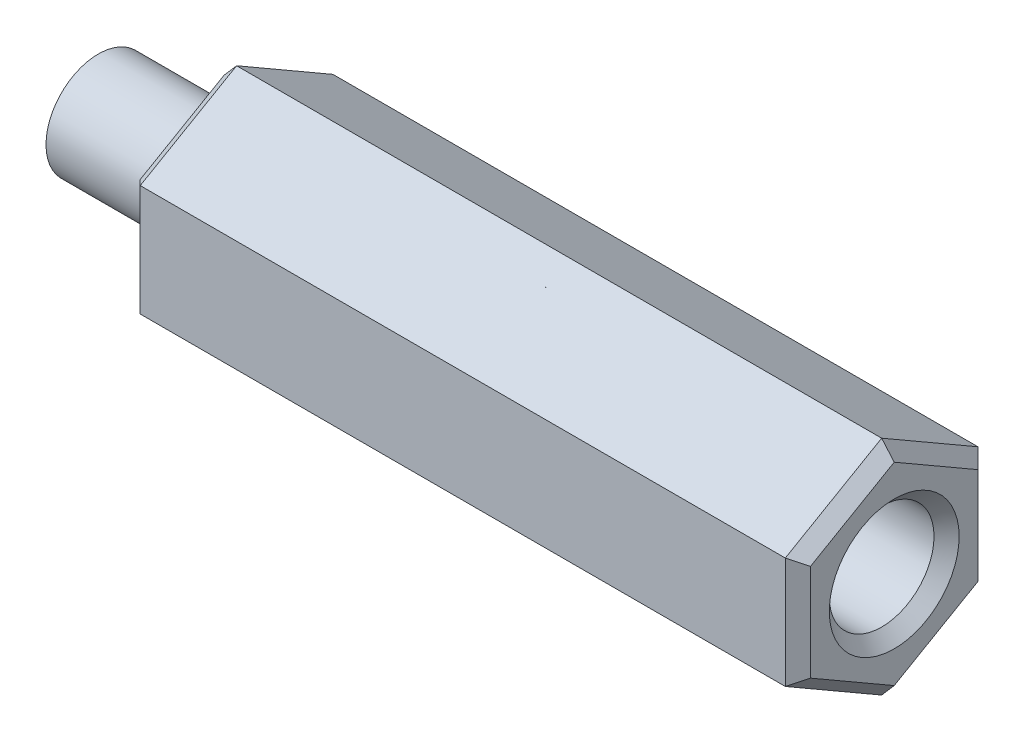
ISO-10303-21;
HEADER;
FILE_DESCRIPTION(('STEP AP214'),'2;1');
FILE_NAME('part.step','',(''),(''),'','','');
FILE_SCHEMA(('AUTOMOTIVE_DESIGN { 1 0 10303 214 1 1 1 1 }'));
ENDSEC;
DATA;
#1=APPLICATION_CONTEXT('core data for automotive mechanical design processes');
#2=APPLICATION_PROTOCOL_DEFINITION('international standard','automotive_design',2000,#1);
#3=PRODUCT_CONTEXT('',#1,'mechanical');
#4=PRODUCT('Part','Part','',(#3));
#5=PRODUCT_RELATED_PRODUCT_CATEGORY('part','',(#4));
#6=PRODUCT_DEFINITION_FORMATION('','',#4);
#7=PRODUCT_DEFINITION_CONTEXT('part definition',#1,'design');
#8=PRODUCT_DEFINITION('design','',#6,#7);
#9=PRODUCT_DEFINITION_SHAPE('','',#8);
#10=(LENGTH_UNIT() NAMED_UNIT(*) SI_UNIT(.MILLI.,.METRE.));
#11=(NAMED_UNIT(*) PLANE_ANGLE_UNIT() SI_UNIT($,.RADIAN.));
#12=(NAMED_UNIT(*) SI_UNIT($,.STERADIAN.) SOLID_ANGLE_UNIT());
#13=UNCERTAINTY_MEASURE_WITH_UNIT(LENGTH_MEASURE(1.E-05),#10,'distance_accuracy_value','');
#14=(GEOMETRIC_REPRESENTATION_CONTEXT(3) GLOBAL_UNCERTAINTY_ASSIGNED_CONTEXT((#13)) GLOBAL_UNIT_ASSIGNED_CONTEXT((#10,
#11,#12)) REPRESENTATION_CONTEXT('',''));
#15=CARTESIAN_POINT('',(0.,0.,0.));
#16=DIRECTION('',(0.,0.,1.));
#17=DIRECTION('',(1.,0.,0.));
#18=AXIS2_PLACEMENT_3D('',#15,#16,#17);
#19=CARTESIAN_POINT('',(16.,0.,0.));
#20=DIRECTION('',(-1.,0.,0.));
#21=DIRECTION('',(0.,0.,1.));
#22=AXIS2_PLACEMENT_3D('',#19,#20,#21);
#23=CYLINDRICAL_SURFACE('',#22,1.25);
#24=CARTESIAN_POINT('',(15.7,0.,0.));
#25=DIRECTION('',(1.,0.,0.));
#26=DIRECTION('',(0.,0.,-1.));
#27=AXIS2_PLACEMENT_3D('',#24,#25,#26);
#28=CIRCLE('',#27,1.25);
#29=CARTESIAN_POINT('',(15.7,0.,-1.25));
#30=VERTEX_POINT('',#29);
#31=EDGE_CURVE('E164',#30,#30,#28,.T.);
#32=ORIENTED_EDGE('',*,*,#31,.T.);
#33=EDGE_LOOP('',(#32));
#34=FACE_BOUND('',#33,.T.);
#35=CARTESIAN_POINT('',(2.,0.,0.));
#36=DIRECTION('',(-1.,0.,0.));
#37=DIRECTION('',(0.,0.,1.));
#38=AXIS2_PLACEMENT_3D('',#35,#36,#37);
#39=CIRCLE('',#38,1.25);
#40=CARTESIAN_POINT('',(2.,0.,1.25));
#41=VERTEX_POINT('',#40);
#42=EDGE_CURVE('E50',#41,#41,#39,.T.);
#43=ORIENTED_EDGE('',*,*,#42,.T.);
#44=EDGE_LOOP('',(#43));
#45=FACE_BOUND('',#44,.T.);
#46=ADVANCED_FACE('F45',(#34,#45),#23,.F.);
#47=CARTESIAN_POINT('',(16.,0.,0.));
#48=DIRECTION('',(1.,0.,0.));
#49=DIRECTION('',(0.,0.,-1.));
#50=AXIS2_PLACEMENT_3D('',#47,#48,#49);
#51=PLANE('',#50);
#52=CARTESIAN_POINT('',(16.,0.,0.));
#53=DIRECTION('',(1.,0.,0.));
#54=DIRECTION('',(0.,0.,-1.));
#55=AXIS2_PLACEMENT_3D('',#52,#53,#54);
#56=CIRCLE('',#55,1.55);
#57=CARTESIAN_POINT('',(16.,0.,-1.55));
#58=VERTEX_POINT('',#57);
#59=EDGE_CURVE('E55',#58,#58,#56,.F.);
#60=ORIENTED_EDGE('',*,*,#59,.T.);
#61=EDGE_LOOP('',(#60));
#62=FACE_BOUND('',#61,.T.);
#63=DIRECTION('',(0.,0.5,-0.866025403784439));
#64=VECTOR('',#63,1.);
#65=CARTESIAN_POINT('',(16.,-1.06809799800081,-2.15));
#66=LINE('',#65,#64);
#67=CARTESIAN_POINT('',(16.,-2.3094010767585,0.));
#68=VERTEX_POINT('',#67);
#69=CARTESIAN_POINT('',(16.,-1.15470053837925,-2.));
#70=VERTEX_POINT('',#69);
#71=EDGE_CURVE('E63',#68,#70,#66,.T.);
#72=ORIENTED_EDGE('',*,*,#71,.T.);
#73=DIRECTION('',(0.,1.,0.));
#74=VECTOR('',#73,1.);
#75=CARTESIAN_POINT('',(16.,1.32790561913614,-2.));
#76=LINE('',#75,#74);
#77=CARTESIAN_POINT('',(16.,1.15470053837925,-2.));
#78=VERTEX_POINT('',#77);
#79=EDGE_CURVE('E204',#70,#78,#76,.T.);
#80=ORIENTED_EDGE('',*,*,#79,.T.);
#81=DIRECTION('',(0.,0.5,0.866025403784439));
#82=VECTOR('',#81,1.);
#83=CARTESIAN_POINT('',(16.,2.39600361713695,0.15));
#84=LINE('',#83,#82);
#85=CARTESIAN_POINT('',(16.,2.3094010767585,0.));
#86=VERTEX_POINT('',#85);
#87=EDGE_CURVE('E196',#78,#86,#84,.T.);
#88=ORIENTED_EDGE('',*,*,#87,.T.);
#89=DIRECTION('',(0.,-0.5,0.866025403784439));
#90=VECTOR('',#89,1.);
#91=CARTESIAN_POINT('',(16.,1.06809799800081,2.15));
#92=LINE('',#91,#90);
#93=CARTESIAN_POINT('',(16.,1.15470053837925,2.));
#94=VERTEX_POINT('',#93);
#95=EDGE_CURVE('E198',#86,#94,#92,.T.);
#96=ORIENTED_EDGE('',*,*,#95,.T.);
#97=DIRECTION('',(0.,-1.,0.));
#98=VECTOR('',#97,1.);
#99=CARTESIAN_POINT('',(16.,-1.32790561913614,2.));
#100=LINE('',#99,#98);
#101=CARTESIAN_POINT('',(16.,-1.15470053837925,2.));
#102=VERTEX_POINT('',#101);
#103=EDGE_CURVE('E200',#94,#102,#100,.T.);
#104=ORIENTED_EDGE('',*,*,#103,.T.);
#105=DIRECTION('',(0.,-0.5,-0.866025403784439));
#106=VECTOR('',#105,1.);
#107=CARTESIAN_POINT('',(16.,-2.39600361713695,-0.149999999999998));
#108=LINE('',#107,#106);
#109=EDGE_CURVE('E68',#102,#68,#108,.T.);
#110=ORIENTED_EDGE('',*,*,#109,.T.);
#111=EDGE_LOOP('',(#72,#80,#88,#96,#104,#110));
#112=FACE_BOUND('',#111,.T.);
#113=ADVANCED_FACE('F310',(#62,#112),#51,.T.);
#114=CARTESIAN_POINT('',(0.,0.,0.));
#115=DIRECTION('',(1.,0.,0.));
#116=DIRECTION('',(0.,0.,-1.));
#117=AXIS2_PLACEMENT_3D('',#114,#115,#116);
#118=PLANE('',#117);
#119=CARTESIAN_POINT('',(0.,0.,0.));
#120=DIRECTION('',(-1.,0.,0.));
#121=DIRECTION('',(0.,0.,1.));
#122=AXIS2_PLACEMENT_3D('',#119,#120,#121);
#123=CIRCLE('',#122,1.25);
#124=CARTESIAN_POINT('',(0.,0.,1.25));
#125=VERTEX_POINT('',#124);
#126=EDGE_CURVE('E11',#125,#125,#123,.T.);
#127=ORIENTED_EDGE('',*,*,#126,.F.);
#128=EDGE_LOOP('',(#127));
#129=FACE_BOUND('',#128,.T.);
#130=DIRECTION('',(0.,1.,0.));
#131=VECTOR('',#130,1.);
#132=CARTESIAN_POINT('',(0.,0.,2.));
#133=LINE('',#132,#131);
#134=CARTESIAN_POINT('',(0.,-1.15470053837925,2.));
#135=VERTEX_POINT('',#134);
#136=CARTESIAN_POINT('',(0.,1.15470053837925,2.));
#137=VERTEX_POINT('',#136);
#138=EDGE_CURVE('E163',#135,#137,#133,.T.);
#139=ORIENTED_EDGE('',*,*,#138,.T.);
#140=DIRECTION('',(0.,0.5,-0.866025403784439));
#141=VECTOR('',#140,1.);
#142=CARTESIAN_POINT('',(0.,1.73205080756888,1.));
#143=LINE('',#142,#141);
#144=CARTESIAN_POINT('',(0.,2.3094010767585,0.));
#145=VERTEX_POINT('',#144);
#146=EDGE_CURVE('E142',#137,#145,#143,.T.);
#147=ORIENTED_EDGE('',*,*,#146,.T.);
#148=DIRECTION('',(0.,-0.5,-0.866025403784439));
#149=VECTOR('',#148,1.);
#150=CARTESIAN_POINT('',(0.,1.73205080756888,-1.));
#151=LINE('',#150,#149);
#152=CARTESIAN_POINT('',(0.,1.15470053837925,-2.));
#153=VERTEX_POINT('',#152);
#154=EDGE_CURVE('E152',#145,#153,#151,.T.);
#155=ORIENTED_EDGE('',*,*,#154,.T.);
#156=DIRECTION('',(0.,-1.,0.));
#157=VECTOR('',#156,1.);
#158=CARTESIAN_POINT('',(0.,0.,-2.));
#159=LINE('',#158,#157);
#160=CARTESIAN_POINT('',(0.,-1.15470053837925,-2.));
#161=VERTEX_POINT('',#160);
#162=EDGE_CURVE('E158',#153,#161,#159,.T.);
#163=ORIENTED_EDGE('',*,*,#162,.T.);
#164=DIRECTION('',(0.,-0.5,0.866025403784439));
#165=VECTOR('',#164,1.);
#166=CARTESIAN_POINT('',(0.,-1.73205080756888,-1.));
#167=LINE('',#166,#165);
#168=CARTESIAN_POINT('',(0.,-2.3094010767585,0.));
#169=VERTEX_POINT('',#168);
#170=EDGE_CURVE('E261',#161,#169,#167,.T.);
#171=ORIENTED_EDGE('',*,*,#170,.T.);
#172=DIRECTION('',(0.,0.5,0.866025403784439));
#173=VECTOR('',#172,1.);
#174=CARTESIAN_POINT('',(0.,-1.73205080756888,1.));
#175=LINE('',#174,#173);
#176=EDGE_CURVE('E169',#169,#135,#175,.T.);
#177=ORIENTED_EDGE('',*,*,#176,.T.);
#178=EDGE_LOOP('',(#139,#147,#155,#163,#171,#177));
#179=FACE_BOUND('',#178,.T.);
#180=ADVANCED_FACE('F161',(#129,#179),#118,.F.);
#181=CARTESIAN_POINT('',(16.,1.32790561913614,-2.3));
#182=DIRECTION('',(0.,-0.866025403784439,0.5));
#183=DIRECTION('',(0.,-0.5,-0.866025403784439));
#184=AXIS2_PLACEMENT_3D('',#181,#182,#183);
#185=PLANE('',#184);
#186=DIRECTION('',(-1.,0.,0.));
#187=VECTOR('',#186,1.);
#188=CARTESIAN_POINT('',(16.,1.32790561913614,-2.3));
#189=LINE('',#188,#187);
#190=CARTESIAN_POINT('',(15.7,1.32790561913614,-2.3));
#191=VERTEX_POINT('',#190);
#192=CARTESIAN_POINT('',(0.300000000000002,1.32790561913614,-2.3));
#193=VERTEX_POINT('',#192);
#194=EDGE_CURVE('E219',#191,#193,#189,.T.);
#195=ORIENTED_EDGE('',*,*,#194,.T.);
#196=DIRECTION('',(0.,0.5,0.866025403784439));
#197=VECTOR('',#196,1.);
#198=CARTESIAN_POINT('',(0.300000000000002,1.32790561913614,-2.3));
#199=LINE('',#198,#197);
#200=CARTESIAN_POINT('',(0.300000000000002,2.65581123827228,0.));
#201=VERTEX_POINT('',#200);
#202=EDGE_CURVE('E194',#193,#201,#199,.T.);
#203=ORIENTED_EDGE('',*,*,#202,.T.);
#204=DIRECTION('',(-1.,0.,0.));
#205=VECTOR('',#204,1.);
#206=CARTESIAN_POINT('',(16.,2.65581123827228,0.));
#207=LINE('',#206,#205);
#208=CARTESIAN_POINT('',(15.7,2.65581123827228,0.));
#209=VERTEX_POINT('',#208);
#210=EDGE_CURVE('E159',#209,#201,#207,.T.);
#211=ORIENTED_EDGE('',*,*,#210,.F.);
#212=DIRECTION('',(0.,-0.5,-0.866025403784439));
#213=VECTOR('',#212,1.);
#214=CARTESIAN_POINT('',(15.7,1.32790561913614,-2.3));
#215=LINE('',#214,#213);
#216=EDGE_CURVE('E192',#209,#191,#215,.T.);
#217=ORIENTED_EDGE('',*,*,#216,.T.);
#218=EDGE_LOOP('',(#195,#203,#211,#217));
#219=FACE_BOUND('',#218,.T.);
#220=ADVANCED_FACE('F319',(#219),#185,.F.);
#221=CARTESIAN_POINT('',(16.,2.65581123827228,0.));
#222=DIRECTION('',(0.,-0.866025403784438,-0.5));
#223=DIRECTION('',(0.,0.5,-0.866025403784438));
#224=AXIS2_PLACEMENT_3D('',#221,#222,#223);
#225=PLANE('',#224);
#226=ORIENTED_EDGE('',*,*,#210,.T.);
#227=DIRECTION('',(0.,-0.5,0.866025403784438));
#228=VECTOR('',#227,1.);
#229=CARTESIAN_POINT('',(0.300000000000002,2.65581123827228,0.));
#230=LINE('',#229,#228);
#231=CARTESIAN_POINT('',(0.300000000000002,1.32790561913614,2.3));
#232=VERTEX_POINT('',#231);
#233=EDGE_CURVE('E145',#201,#232,#230,.T.);
#234=ORIENTED_EDGE('',*,*,#233,.T.);
#235=DIRECTION('',(-1.,0.,0.));
#236=VECTOR('',#235,1.);
#237=CARTESIAN_POINT('',(16.,1.32790561913614,2.3));
#238=LINE('',#237,#236);
#239=CARTESIAN_POINT('',(15.7,1.32790561913614,2.3));
#240=VERTEX_POINT('',#239);
#241=EDGE_CURVE('E247',#240,#232,#238,.T.);
#242=ORIENTED_EDGE('',*,*,#241,.F.);
#243=DIRECTION('',(0.,0.5,-0.866025403784438));
#244=VECTOR('',#243,1.);
#245=CARTESIAN_POINT('',(15.7,2.65581123827228,0.));
#246=LINE('',#245,#244);
#247=EDGE_CURVE('E167',#240,#209,#246,.T.);
#248=ORIENTED_EDGE('',*,*,#247,.T.);
#249=EDGE_LOOP('',(#226,#234,#242,#248));
#250=FACE_BOUND('',#249,.T.);
#251=ADVANCED_FACE('F252',(#250),#225,.F.);
#252=CARTESIAN_POINT('',(16.,1.32790561913614,2.3));
#253=DIRECTION('',(0.,0.,-1.));
#254=DIRECTION('',(0.,1.,0.));
#255=AXIS2_PLACEMENT_3D('',#252,#253,#254);
#256=PLANE('',#255);
#257=ORIENTED_EDGE('',*,*,#241,.T.);
#258=DIRECTION('',(0.,-1.,0.));
#259=VECTOR('',#258,1.);
#260=CARTESIAN_POINT('',(0.300000000000002,1.32790561913614,2.3));
#261=LINE('',#260,#259);
#262=CARTESIAN_POINT('',(0.300000000000002,-1.32790561913614,2.3));
#263=VERTEX_POINT('',#262);
#264=EDGE_CURVE('E177',#232,#263,#261,.T.);
#265=ORIENTED_EDGE('',*,*,#264,.T.);
#266=DIRECTION('',(-1.,0.,0.));
#267=VECTOR('',#266,1.);
#268=CARTESIAN_POINT('',(16.,-1.32790561913614,2.3));
#269=LINE('',#268,#267);
#270=CARTESIAN_POINT('',(15.7,-1.32790561913614,2.3));
#271=VERTEX_POINT('',#270);
#272=EDGE_CURVE('E249',#271,#263,#269,.T.);
#273=ORIENTED_EDGE('',*,*,#272,.F.);
#274=DIRECTION('',(0.,1.,0.));
#275=VECTOR('',#274,1.);
#276=CARTESIAN_POINT('',(15.7,1.32790561913614,2.3));
#277=LINE('',#276,#275);
#278=EDGE_CURVE('E175',#271,#240,#277,.T.);
#279=ORIENTED_EDGE('',*,*,#278,.T.);
#280=EDGE_LOOP('',(#257,#265,#273,#279));
#281=FACE_BOUND('',#280,.T.);
#282=ADVANCED_FACE('F246',(#281),#256,.F.);
#283=CARTESIAN_POINT('',(16.,-1.32790561913614,2.3));
#284=DIRECTION('',(0.,0.866025403784438,-0.5));
#285=DIRECTION('',(0.,0.5,0.866025403784439));
#286=AXIS2_PLACEMENT_3D('',#283,#284,#285);
#287=PLANE('',#286);
#288=ORIENTED_EDGE('',*,*,#272,.T.);
#289=DIRECTION('',(0.,-0.5,-0.866025403784439));
#290=VECTOR('',#289,1.);
#291=CARTESIAN_POINT('',(0.300000000000002,-1.32790561913614,2.3));
#292=LINE('',#291,#290);
#293=CARTESIAN_POINT('',(0.300000000000002,-2.65581123827228,0.));
#294=VERTEX_POINT('',#293);
#295=EDGE_CURVE('E181',#263,#294,#292,.T.);
#296=ORIENTED_EDGE('',*,*,#295,.T.);
#297=DIRECTION('',(-1.,0.,0.));
#298=VECTOR('',#297,1.);
#299=CARTESIAN_POINT('',(16.,-2.65581123827228,0.));
#300=LINE('',#299,#298);
#301=CARTESIAN_POINT('',(15.7,-2.65581123827228,0.));
#302=VERTEX_POINT('',#301);
#303=EDGE_CURVE('E256',#302,#294,#300,.T.);
#304=ORIENTED_EDGE('',*,*,#303,.F.);
#305=DIRECTION('',(0.,0.5,0.866025403784439));
#306=VECTOR('',#305,1.);
#307=CARTESIAN_POINT('',(15.7,-1.32790561913614,2.3));
#308=LINE('',#307,#306);
#309=EDGE_CURVE('E179',#302,#271,#308,.T.);
#310=ORIENTED_EDGE('',*,*,#309,.T.);
#311=EDGE_LOOP('',(#288,#296,#304,#310));
#312=FACE_BOUND('',#311,.T.);
#313=ADVANCED_FACE('F273',(#312),#287,.F.);
#314=CARTESIAN_POINT('',(16.,-2.65581123827228,0.));
#315=DIRECTION('',(0.,0.866025403784439,0.5));
#316=DIRECTION('',(0.,-0.5,0.866025403784439));
#317=AXIS2_PLACEMENT_3D('',#314,#315,#316);
#318=PLANE('',#317);
#319=ORIENTED_EDGE('',*,*,#303,.T.);
#320=DIRECTION('',(0.,0.5,-0.866025403784439));
#321=VECTOR('',#320,1.);
#322=CARTESIAN_POINT('',(0.300000000000002,-2.65581123827228,0.));
#323=LINE('',#322,#321);
#324=CARTESIAN_POINT('',(0.300000000000002,-1.32790561913614,-2.3));
#325=VERTEX_POINT('',#324);
#326=EDGE_CURVE('E185',#294,#325,#323,.T.);
#327=ORIENTED_EDGE('',*,*,#326,.T.);
#328=DIRECTION('',(-1.,0.,0.));
#329=VECTOR('',#328,1.);
#330=CARTESIAN_POINT('',(16.,-1.32790561913614,-2.3));
#331=LINE('',#330,#329);
#332=CARTESIAN_POINT('',(15.7,-1.32790561913614,-2.3));
#333=VERTEX_POINT('',#332);
#334=EDGE_CURVE('E278',#333,#325,#331,.T.);
#335=ORIENTED_EDGE('',*,*,#334,.F.);
#336=DIRECTION('',(0.,-0.5,0.866025403784439));
#337=VECTOR('',#336,1.);
#338=CARTESIAN_POINT('',(15.7,-2.65581123827228,0.));
#339=LINE('',#338,#337);
#340=EDGE_CURVE('E183',#333,#302,#339,.T.);
#341=ORIENTED_EDGE('',*,*,#340,.T.);
#342=EDGE_LOOP('',(#319,#327,#335,#341));
#343=FACE_BOUND('',#342,.T.);
#344=ADVANCED_FACE('F325',(#343),#318,.F.);
#345=CARTESIAN_POINT('',(16.,-1.32790561913614,-2.3));
#346=DIRECTION('',(0.,0.,1.));
#347=DIRECTION('',(1.,0.,0.));
#348=AXIS2_PLACEMENT_3D('',#345,#346,#347);
#349=PLANE('',#348);
#350=ORIENTED_EDGE('',*,*,#334,.T.);
#351=DIRECTION('',(0.,1.,0.));
#352=VECTOR('',#351,1.);
#353=CARTESIAN_POINT('',(0.300000000000002,-1.32790561913614,-2.3));
#354=LINE('',#353,#352);
#355=EDGE_CURVE('E190',#325,#193,#354,.T.);
#356=ORIENTED_EDGE('',*,*,#355,.T.);
#357=ORIENTED_EDGE('',*,*,#194,.F.);
#358=DIRECTION('',(0.,-1.,0.));
#359=VECTOR('',#358,1.);
#360=CARTESIAN_POINT('',(15.7,-1.32790561913614,-2.3));
#361=LINE('',#360,#359);
#362=EDGE_CURVE('E187',#191,#333,#361,.T.);
#363=ORIENTED_EDGE('',*,*,#362,.T.);
#364=EDGE_LOOP('',(#350,#356,#357,#363));
#365=FACE_BOUND('',#364,.T.);
#366=ADVANCED_FACE('F321',(#365),#349,.F.);
#367=CARTESIAN_POINT('',(0.300000000000002,-2.65581123827228,0.));
#368=DIRECTION('',(0.707106781186545,0.612372435695796,0.353553390593275));
#369=DIRECTION('',(0.,0.5,-0.866025403784439));
#370=AXIS2_PLACEMENT_3D('',#367,#368,#369);
#371=PLANE('',#370);
#372=DIRECTION('',(-0.65465367070798,0.755928946018452,0.));
#373=VECTOR('',#372,1.);
#374=CARTESIAN_POINT('',(0.300000000000002,-2.65581123827228,0.));
#375=LINE('',#374,#373);
#376=EDGE_CURVE('E213',#169,#294,#375,.F.);
#377=ORIENTED_EDGE('',*,*,#376,.F.);
#378=ORIENTED_EDGE('',*,*,#170,.F.);
#379=DIRECTION('',(-0.654653670707979,0.377964473009226,0.654653670707976));
#380=VECTOR('',#379,1.);
#381=CARTESIAN_POINT('',(0.300000000000002,-1.32790561913614,-2.3));
#382=LINE('',#381,#380);
#383=EDGE_CURVE('E216',#325,#161,#382,.T.);
#384=ORIENTED_EDGE('',*,*,#383,.F.);
#385=ORIENTED_EDGE('',*,*,#326,.F.);
#386=EDGE_LOOP('',(#377,#378,#384,#385));
#387=FACE_BOUND('',#386,.T.);
#388=ADVANCED_FACE('F324',(#387),#371,.F.);
#389=CARTESIAN_POINT('',(0.300000000000002,-1.32790561913614,-2.3));
#390=DIRECTION('',(0.707106781186546,0.,0.70710678118655));
#391=DIRECTION('',(0.,1.,0.));
#392=AXIS2_PLACEMENT_3D('',#389,#390,#391);
#393=PLANE('',#392);
#394=ORIENTED_EDGE('',*,*,#383,.T.);
#395=ORIENTED_EDGE('',*,*,#162,.F.);
#396=DIRECTION('',(-0.65465367070798,-0.377964473009226,0.654653670707976));
#397=VECTOR('',#396,1.);
#398=CARTESIAN_POINT('',(0.300000000000002,1.32790561913614,-2.3));
#399=LINE('',#398,#397);
#400=EDGE_CURVE('E155',#193,#153,#399,.T.);
#401=ORIENTED_EDGE('',*,*,#400,.F.);
#402=ORIENTED_EDGE('',*,*,#355,.F.);
#403=EDGE_LOOP('',(#394,#395,#401,#402));
#404=FACE_BOUND('',#403,.T.);
#405=ADVANCED_FACE('F361',(#404),#393,.F.);
#406=CARTESIAN_POINT('',(0.300000000000002,-1.32790561913614,2.3));
#407=DIRECTION('',(0.707106781186545,0.612372435695796,-0.353553390593275));
#408=DIRECTION('',(0.,-0.5,-0.866025403784439));
#409=AXIS2_PLACEMENT_3D('',#406,#407,#408);
#410=PLANE('',#409);
#411=ORIENTED_EDGE('',*,*,#376,.T.);
#412=ORIENTED_EDGE('',*,*,#295,.F.);
#413=DIRECTION('',(-0.65465367070798,0.377964473009226,-0.654653670707975));
#414=VECTOR('',#413,1.);
#415=CARTESIAN_POINT('',(0.300000000000002,-1.32790561913614,2.3));
#416=LINE('',#415,#414);
#417=EDGE_CURVE('E148',#135,#263,#416,.F.);
#418=ORIENTED_EDGE('',*,*,#417,.F.);
#419=ORIENTED_EDGE('',*,*,#176,.F.);
#420=EDGE_LOOP('',(#411,#412,#418,#419));
#421=FACE_BOUND('',#420,.T.);
#422=ADVANCED_FACE('F268',(#421),#410,.F.);
#423=CARTESIAN_POINT('',(0.300000000000002,1.32790561913614,-2.3));
#424=DIRECTION('',(0.707106781186545,-0.612372435695797,0.353553390593275));
#425=DIRECTION('',(0.,0.5,0.866025403784439));
#426=AXIS2_PLACEMENT_3D('',#423,#424,#425);
#427=PLANE('',#426);
#428=ORIENTED_EDGE('',*,*,#400,.T.);
#429=ORIENTED_EDGE('',*,*,#154,.F.);
#430=DIRECTION('',(0.654653670707979,0.755928946018453,0.));
#431=VECTOR('',#430,1.);
#432=CARTESIAN_POINT('',(-0.357142857142857,1.89700802733735,0.));
#433=LINE('',#432,#431);
#434=EDGE_CURVE('E138',#201,#145,#433,.F.);
#435=ORIENTED_EDGE('',*,*,#434,.F.);
#436=ORIENTED_EDGE('',*,*,#202,.F.);
#437=EDGE_LOOP('',(#428,#429,#435,#436));
#438=FACE_BOUND('',#437,.T.);
#439=ADVANCED_FACE('F153',(#438),#427,.F.);
#440=CARTESIAN_POINT('',(0.300000000000002,1.32790561913614,2.3));
#441=DIRECTION('',(0.707106781186545,0.,-0.70710678118655));
#442=DIRECTION('',(0.,-1.,0.));
#443=AXIS2_PLACEMENT_3D('',#440,#441,#442);
#444=PLANE('',#443);
#445=ORIENTED_EDGE('',*,*,#417,.T.);
#446=ORIENTED_EDGE('',*,*,#264,.F.);
#447=DIRECTION('',(-0.654653670707979,-0.377964473009226,-0.654653670707975));
#448=VECTOR('',#447,1.);
#449=CARTESIAN_POINT('',(0.300000000000002,1.32790561913614,2.3));
#450=LINE('',#449,#448);
#451=EDGE_CURVE('E149',#137,#232,#450,.F.);
#452=ORIENTED_EDGE('',*,*,#451,.F.);
#453=ORIENTED_EDGE('',*,*,#138,.F.);
#454=EDGE_LOOP('',(#445,#446,#452,#453));
#455=FACE_BOUND('',#454,.T.);
#456=ADVANCED_FACE('F271',(#455),#444,.F.);
#457=CARTESIAN_POINT('',(0.300000000000002,2.65581123827228,0.));
#458=DIRECTION('',(0.707106781186545,-0.612372435695796,-0.353553390593275));
#459=DIRECTION('',(0.,-0.5,0.866025403784438));
#460=AXIS2_PLACEMENT_3D('',#457,#458,#459);
#461=PLANE('',#460);
#462=ORIENTED_EDGE('',*,*,#434,.T.);
#463=ORIENTED_EDGE('',*,*,#146,.F.);
#464=ORIENTED_EDGE('',*,*,#451,.T.);
#465=ORIENTED_EDGE('',*,*,#233,.F.);
#466=EDGE_LOOP('',(#462,#463,#464,#465));
#467=FACE_BOUND('',#466,.T.);
#468=ADVANCED_FACE('F140',(#467),#461,.F.);
#469=CARTESIAN_POINT('',(15.7,0.,0.));
#470=DIRECTION('',(1.,0.,0.));
#471=DIRECTION('',(0.,0.,-1.));
#472=AXIS2_PLACEMENT_3D('',#469,#470,#471);
#473=CONICAL_SURFACE('',#472,1.25,0.785398163397447);
#474=ORIENTED_EDGE('',*,*,#59,.F.);
#475=EDGE_LOOP('',(#474));
#476=FACE_BOUND('',#475,.T.);
#477=ORIENTED_EDGE('',*,*,#31,.F.);
#478=EDGE_LOOP('',(#477));
#479=FACE_BOUND('',#478,.T.);
#480=ADVANCED_FACE('F345',(#476,#479),#473,.F.);
#481=CARTESIAN_POINT('',(16.,0.,2.));
#482=DIRECTION('',(0.707106781186545,0.,0.70710678118655));
#483=DIRECTION('',(0.,1.,0.));
#484=AXIS2_PLACEMENT_3D('',#481,#482,#483);
#485=PLANE('',#484);
#486=DIRECTION('',(0.654653670707979,-0.377964473009226,-0.654653670707975));
#487=VECTOR('',#486,1.);
#488=CARTESIAN_POINT('',(16.2857142857143,0.989743318610787,1.71428571428572));
#489=LINE('',#488,#487);
#490=EDGE_CURVE('E230',#240,#94,#489,.T.);
#491=ORIENTED_EDGE('',*,*,#490,.F.);
#492=ORIENTED_EDGE('',*,*,#278,.F.);
#493=DIRECTION('',(0.65465367070798,0.377964473009226,-0.654653670707975));
#494=VECTOR('',#493,1.);
#495=CARTESIAN_POINT('',(16.2857142857143,-0.989743318610788,1.71428571428572));
#496=LINE('',#495,#494);
#497=EDGE_CURVE('E208',#102,#271,#496,.F.);
#498=ORIENTED_EDGE('',*,*,#497,.F.);
#499=ORIENTED_EDGE('',*,*,#103,.F.);
#500=EDGE_LOOP('',(#491,#492,#498,#499));
#501=FACE_BOUND('',#500,.T.);
#502=ADVANCED_FACE('F48',(#501),#485,.T.);
#503=CARTESIAN_POINT('',(16.,-1.73205080756888,1.));
#504=DIRECTION('',(0.707106781186545,-0.612372435695796,0.353553390593275));
#505=DIRECTION('',(0.,0.5,0.866025403784439));
#506=AXIS2_PLACEMENT_3D('',#503,#504,#505);
#507=PLANE('',#506);
#508=ORIENTED_EDGE('',*,*,#497,.T.);
#509=ORIENTED_EDGE('',*,*,#309,.F.);
#510=DIRECTION('',(0.65465367070798,0.755928946018452,0.));
#511=VECTOR('',#510,1.);
#512=CARTESIAN_POINT('',(16.2857142857143,-1.97948663722158,0.));
#513=LINE('',#512,#511);
#514=EDGE_CURVE('E227',#68,#302,#513,.F.);
#515=ORIENTED_EDGE('',*,*,#514,.F.);
#516=ORIENTED_EDGE('',*,*,#109,.F.);
#517=EDGE_LOOP('',(#508,#509,#515,#516));
#518=FACE_BOUND('',#517,.T.);
#519=ADVANCED_FACE('F236',(#518),#507,.T.);
#520=CARTESIAN_POINT('',(16.,1.73205080756888,1.));
#521=DIRECTION('',(0.707106781186545,0.612372435695796,0.353553390593275));
#522=DIRECTION('',(0.,0.5,-0.866025403784438));
#523=AXIS2_PLACEMENT_3D('',#520,#521,#522);
#524=PLANE('',#523);
#525=ORIENTED_EDGE('',*,*,#490,.T.);
#526=ORIENTED_EDGE('',*,*,#95,.F.);
#527=DIRECTION('',(0.654653670707979,-0.755928946018453,0.));
#528=VECTOR('',#527,1.);
#529=CARTESIAN_POINT('',(16.2857142857143,1.97948663722158,0.));
#530=LINE('',#529,#528);
#531=EDGE_CURVE('E224',#209,#86,#530,.T.);
#532=ORIENTED_EDGE('',*,*,#531,.F.);
#533=ORIENTED_EDGE('',*,*,#247,.F.);
#534=EDGE_LOOP('',(#525,#526,#532,#533));
#535=FACE_BOUND('',#534,.T.);
#536=ADVANCED_FACE('F394',(#535),#524,.T.);
#537=CARTESIAN_POINT('',(16.,-1.73205080756888,-1.));
#538=DIRECTION('',(0.707106781186545,-0.612372435695796,-0.353553390593275));
#539=DIRECTION('',(0.,-0.5,0.866025403784439));
#540=AXIS2_PLACEMENT_3D('',#537,#538,#539);
#541=PLANE('',#540);
#542=ORIENTED_EDGE('',*,*,#514,.T.);
#543=ORIENTED_EDGE('',*,*,#340,.F.);
#544=DIRECTION('',(0.654653670707979,0.377964473009226,0.654653670707976));
#545=VECTOR('',#544,1.);
#546=CARTESIAN_POINT('',(16.2857142857143,-0.989743318610787,-1.71428571428572));
#547=LINE('',#546,#545);
#548=EDGE_CURVE('E222',#70,#333,#547,.F.);
#549=ORIENTED_EDGE('',*,*,#548,.F.);
#550=ORIENTED_EDGE('',*,*,#71,.F.);
#551=EDGE_LOOP('',(#542,#543,#549,#550));
#552=FACE_BOUND('',#551,.T.);
#553=ADVANCED_FACE('F387',(#552),#541,.T.);
#554=CARTESIAN_POINT('',(16.,1.73205080756888,-1.));
#555=DIRECTION('',(0.707106781186545,0.612372435695797,-0.353553390593275));
#556=DIRECTION('',(0.,-0.5,-0.866025403784439));
#557=AXIS2_PLACEMENT_3D('',#554,#555,#556);
#558=PLANE('',#557);
#559=ORIENTED_EDGE('',*,*,#531,.T.);
#560=ORIENTED_EDGE('',*,*,#87,.F.);
#561=DIRECTION('',(-0.65465367070798,0.377964473009226,-0.654653670707976));
#562=VECTOR('',#561,1.);
#563=CARTESIAN_POINT('',(16.2857142857143,0.989743318610788,-1.71428571428572));
#564=LINE('',#563,#562);
#565=EDGE_CURVE('E220',#191,#78,#564,.F.);
#566=ORIENTED_EDGE('',*,*,#565,.F.);
#567=ORIENTED_EDGE('',*,*,#216,.F.);
#568=EDGE_LOOP('',(#559,#560,#566,#567));
#569=FACE_BOUND('',#568,.T.);
#570=ADVANCED_FACE('F306',(#569),#558,.T.);
#571=CARTESIAN_POINT('',(16.,0.,-2.));
#572=DIRECTION('',(0.707106781186546,0.,-0.70710678118655));
#573=DIRECTION('',(0.,-1.,0.));
#574=AXIS2_PLACEMENT_3D('',#571,#572,#573);
#575=PLANE('',#574);
#576=ORIENTED_EDGE('',*,*,#548,.T.);
#577=ORIENTED_EDGE('',*,*,#362,.F.);
#578=ORIENTED_EDGE('',*,*,#565,.T.);
#579=ORIENTED_EDGE('',*,*,#79,.F.);
#580=EDGE_LOOP('',(#576,#577,#578,#579));
#581=FACE_BOUND('',#580,.T.);
#582=ADVANCED_FACE('F295',(#581),#575,.T.);
#583=CARTESIAN_POINT('',(2.,0.,0.));
#584=DIRECTION('',(-1.,0.,0.));
#585=DIRECTION('',(0.,0.,1.));
#586=AXIS2_PLACEMENT_3D('',#583,#584,#585);
#587=PLANE('',#586);
#588=ORIENTED_EDGE('',*,*,#42,.F.);
#589=EDGE_LOOP('',(#588));
#590=FACE_BOUND('',#589,.T.);
#591=ADVANCED_FACE('F292',(#590),#587,.F.);
#592=CARTESIAN_POINT('',(-3.,0.,0.));
#593=DIRECTION('',(1.,0.,0.));
#594=DIRECTION('',(0.,0.,-1.));
#595=AXIS2_PLACEMENT_3D('',#592,#593,#594);
#596=CYLINDRICAL_SURFACE('',#595,1.25);
#597=CARTESIAN_POINT('',(-3.,0.,0.));
#598=DIRECTION('',(-1.,0.,0.));
#599=DIRECTION('',(0.,0.,1.));
#600=AXIS2_PLACEMENT_3D('',#597,#598,#599);
#601=CIRCLE('',#600,1.25);
#602=CARTESIAN_POINT('',(-3.,0.,1.25));
#603=VERTEX_POINT('',#602);
#604=EDGE_CURVE('E284',#603,#603,#601,.T.);
#605=ORIENTED_EDGE('',*,*,#604,.F.);
#606=EDGE_LOOP('',(#605));
#607=FACE_BOUND('',#606,.T.);
#608=ORIENTED_EDGE('',*,*,#126,.T.);
#609=EDGE_LOOP('',(#608));
#610=FACE_BOUND('',#609,.T.);
#611=ADVANCED_FACE('F294',(#607,#610),#596,.T.);
#612=CARTESIAN_POINT('',(-3.,0.,0.));
#613=DIRECTION('',(-1.,0.,0.));
#614=DIRECTION('',(0.,0.,1.));
#615=AXIS2_PLACEMENT_3D('',#612,#613,#614);
#616=PLANE('',#615);
#617=ORIENTED_EDGE('',*,*,#604,.T.);
#618=EDGE_LOOP('',(#617));
#619=FACE_BOUND('',#618,.T.);
#620=ADVANCED_FACE('F302',(#619),#616,.T.);
#621=CLOSED_SHELL('',(#46,#113,#180,#220,#251,#282,#313,#344,#366,#388,#405,#422,#439,#456,#468,
#480,#502,#519,#536,#553,#570,#582,#591,#611,#620));
#622=MANIFOLD_SOLID_BREP('B2',#621);
#623=ADVANCED_BREP_SHAPE_REPRESENTATION('',(#18,#622),#14);
#624=SHAPE_DEFINITION_REPRESENTATION(#9,#623);
ENDSEC;
END-ISO-10303-21;
